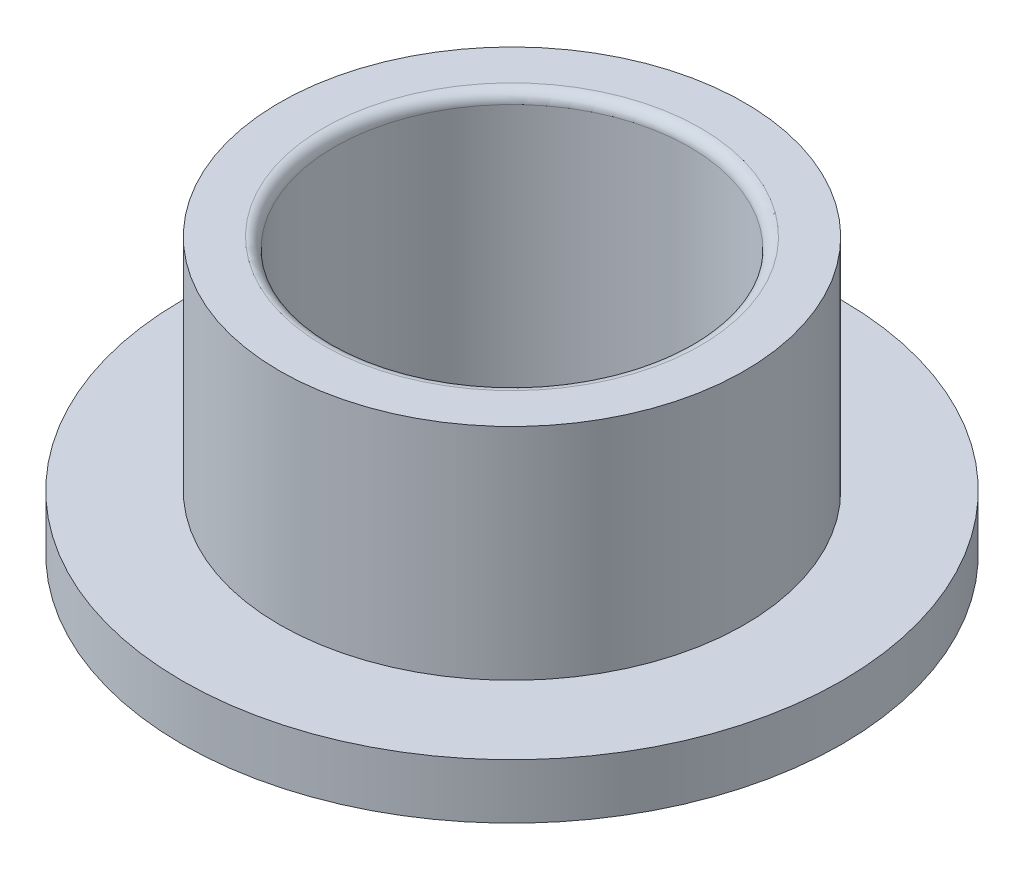
ISO-10303-21;
HEADER;
FILE_DESCRIPTION(('STEP AP214'),'2;1');
FILE_NAME('part.step','',(''),(''),'','','');
FILE_SCHEMA(('AUTOMOTIVE_DESIGN { 1 0 10303 214 1 1 1 1 }'));
ENDSEC;
DATA;
#1=APPLICATION_CONTEXT('core data for automotive mechanical design processes');
#2=APPLICATION_PROTOCOL_DEFINITION('international standard','automotive_design',2000,#1);
#3=PRODUCT_CONTEXT('',#1,'mechanical');
#4=PRODUCT('Part','Part','',(#3));
#5=PRODUCT_RELATED_PRODUCT_CATEGORY('part','',(#4));
#6=PRODUCT_DEFINITION_FORMATION('','',#4);
#7=PRODUCT_DEFINITION_CONTEXT('part definition',#1,'design');
#8=PRODUCT_DEFINITION('design','',#6,#7);
#9=PRODUCT_DEFINITION_SHAPE('','',#8);
#10=(LENGTH_UNIT() NAMED_UNIT(*) SI_UNIT(.MILLI.,.METRE.));
#11=(NAMED_UNIT(*) PLANE_ANGLE_UNIT() SI_UNIT($,.RADIAN.));
#12=(NAMED_UNIT(*) SI_UNIT($,.STERADIAN.) SOLID_ANGLE_UNIT());
#13=UNCERTAINTY_MEASURE_WITH_UNIT(LENGTH_MEASURE(1.E-05),#10,'distance_accuracy_value','');
#14=(GEOMETRIC_REPRESENTATION_CONTEXT(3) GLOBAL_UNCERTAINTY_ASSIGNED_CONTEXT((#13)) GLOBAL_UNIT_ASSIGNED_CONTEXT((#10,
#11,#12)) REPRESENTATION_CONTEXT('',''));
#15=CARTESIAN_POINT('',(0.,0.,0.));
#16=DIRECTION('',(0.,0.,1.));
#17=DIRECTION('',(1.,0.,0.));
#18=AXIS2_PLACEMENT_3D('',#15,#16,#17);
#19=CARTESIAN_POINT('',(0.,20.,0.));
#20=DIRECTION('',(0.,1.,0.));
#21=DIRECTION('',(0.,0.,1.));
#22=AXIS2_PLACEMENT_3D('',#19,#20,#21);
#23=PLANE('',#22);
#24=CARTESIAN_POINT('',(0.,20.,0.));
#25=DIRECTION('',(0.,1.,0.));
#26=DIRECTION('',(0.,0.,1.));
#27=AXIS2_PLACEMENT_3D('',#24,#25,#26);
#28=CIRCLE('',#27,17.15);
#29=CARTESIAN_POINT('',(0.,20.,17.15));
#30=VERTEX_POINT('',#29);
#31=EDGE_CURVE('E42',#30,#30,#28,.F.);
#32=ORIENTED_EDGE('',*,*,#31,.T.);
#33=EDGE_LOOP('',(#32));
#34=FACE_BOUND('',#33,.T.);
#35=CARTESIAN_POINT('',(0.,20.,0.));
#36=DIRECTION('',(0.,1.,0.));
#37=DIRECTION('',(0.,0.,1.));
#38=AXIS2_PLACEMENT_3D('',#35,#36,#37);
#39=CIRCLE('',#38,21.15);
#40=CARTESIAN_POINT('',(0.,20.,21.15));
#41=VERTEX_POINT('',#40);
#42=EDGE_CURVE('E51',#41,#41,#39,.T.);
#43=ORIENTED_EDGE('',*,*,#42,.T.);
#44=EDGE_LOOP('',(#43));
#45=FACE_BOUND('',#44,.T.);
#46=ADVANCED_FACE('F31',(#34,#45),#23,.T.);
#47=CARTESIAN_POINT('',(0.,20.,0.));
#48=DIRECTION('',(0.,-1.,0.));
#49=DIRECTION('',(0.,0.,-1.));
#50=AXIS2_PLACEMENT_3D('',#47,#48,#49);
#51=CYLINDRICAL_SURFACE('',#50,21.15);
#52=ORIENTED_EDGE('',*,*,#42,.F.);
#53=EDGE_LOOP('',(#52));
#54=FACE_BOUND('',#53,.T.);
#55=CARTESIAN_POINT('',(0.,0.,0.));
#56=DIRECTION('',(0.,1.,0.));
#57=DIRECTION('',(0.,0.,1.));
#58=AXIS2_PLACEMENT_3D('',#55,#56,#57);
#59=CIRCLE('',#58,21.15);
#60=CARTESIAN_POINT('',(0.,0.,21.15));
#61=VERTEX_POINT('',#60);
#62=EDGE_CURVE('E52',#61,#61,#59,.T.);
#63=ORIENTED_EDGE('',*,*,#62,.T.);
#64=EDGE_LOOP('',(#63));
#65=FACE_BOUND('',#64,.T.);
#66=ADVANCED_FACE('F83',(#54,#65),#51,.T.);
#67=CARTESIAN_POINT('',(0.,20.,0.));
#68=DIRECTION('',(0.,-1.,0.));
#69=DIRECTION('',(0.,0.,-1.));
#70=AXIS2_PLACEMENT_3D('',#67,#68,#69);
#71=CYLINDRICAL_SURFACE('',#70,16.15);
#72=CARTESIAN_POINT('',(0.,-4.,0.));
#73=DIRECTION('',(0.,-1.,0.));
#74=DIRECTION('',(0.,0.,-1.));
#75=AXIS2_PLACEMENT_3D('',#72,#73,#74);
#76=CIRCLE('',#75,16.15);
#77=CARTESIAN_POINT('',(0.,-4.,-16.15));
#78=VERTEX_POINT('',#77);
#79=EDGE_CURVE('E38',#78,#78,#76,.T.);
#80=ORIENTED_EDGE('',*,*,#79,.T.);
#81=EDGE_LOOP('',(#80));
#82=FACE_BOUND('',#81,.T.);
#83=CARTESIAN_POINT('',(0.,19.,0.));
#84=DIRECTION('',(0.,1.,0.));
#85=DIRECTION('',(0.,0.,1.));
#86=AXIS2_PLACEMENT_3D('',#83,#84,#85);
#87=CIRCLE('',#86,16.15);
#88=CARTESIAN_POINT('',(0.,19.,16.15));
#89=VERTEX_POINT('',#88);
#90=EDGE_CURVE('E46',#89,#89,#87,.T.);
#91=ORIENTED_EDGE('',*,*,#90,.T.);
#92=EDGE_LOOP('',(#91));
#93=FACE_BOUND('',#92,.T.);
#94=ADVANCED_FACE('F89',(#82,#93),#71,.F.);
#95=CARTESIAN_POINT('',(0.,19.,0.));
#96=DIRECTION('',(0.,1.,0.));
#97=DIRECTION('',(0.,0.,1.));
#98=AXIS2_PLACEMENT_3D('',#95,#96,#97);
#99=TOROIDAL_SURFACE('',#98,17.15,1.);
#100=ORIENTED_EDGE('',*,*,#31,.F.);
#101=EDGE_LOOP('',(#100));
#102=FACE_BOUND('',#101,.T.);
#103=ORIENTED_EDGE('',*,*,#90,.F.);
#104=EDGE_LOOP('',(#103));
#105=FACE_BOUND('',#104,.T.);
#106=ADVANCED_FACE('F79',(#102,#105),#99,.T.);
#107=CARTESIAN_POINT('',(0.,-5.,0.));
#108=DIRECTION('',(0.,-1.,0.));
#109=DIRECTION('',(0.,0.,-1.));
#110=AXIS2_PLACEMENT_3D('',#107,#108,#109);
#111=PLANE('',#110);
#112=CARTESIAN_POINT('',(0.,-5.,0.));
#113=DIRECTION('',(0.,-1.,0.));
#114=DIRECTION('',(0.,0.,-1.));
#115=AXIS2_PLACEMENT_3D('',#112,#113,#114);
#116=CIRCLE('',#115,17.15);
#117=CARTESIAN_POINT('',(0.,-5.,-17.15));
#118=VERTEX_POINT('',#117);
#119=EDGE_CURVE('E10',#118,#118,#116,.F.);
#120=ORIENTED_EDGE('',*,*,#119,.T.);
#121=EDGE_LOOP('',(#120));
#122=FACE_BOUND('',#121,.T.);
#123=CARTESIAN_POINT('',(0.,-5.,0.));
#124=DIRECTION('',(0.,-1.,0.));
#125=DIRECTION('',(0.,0.,-1.));
#126=AXIS2_PLACEMENT_3D('',#123,#124,#125);
#127=CIRCLE('',#126,30.);
#128=CARTESIAN_POINT('',(0.,-5.,-30.));
#129=VERTEX_POINT('',#128);
#130=EDGE_CURVE('E55',#129,#129,#127,.T.);
#131=ORIENTED_EDGE('',*,*,#130,.T.);
#132=EDGE_LOOP('',(#131));
#133=FACE_BOUND('',#132,.T.);
#134=ADVANCED_FACE('F64',(#122,#133),#111,.T.);
#135=CARTESIAN_POINT('',(0.,0.,0.));
#136=DIRECTION('',(0.,-1.,0.));
#137=DIRECTION('',(0.,0.,-1.));
#138=AXIS2_PLACEMENT_3D('',#135,#136,#137);
#139=PLANE('',#138);
#140=ORIENTED_EDGE('',*,*,#62,.F.);
#141=EDGE_LOOP('',(#140));
#142=FACE_BOUND('',#141,.T.);
#143=CARTESIAN_POINT('',(0.,0.,0.));
#144=DIRECTION('',(0.,-1.,0.));
#145=DIRECTION('',(0.,0.,-1.));
#146=AXIS2_PLACEMENT_3D('',#143,#144,#145);
#147=CIRCLE('',#146,30.);
#148=CARTESIAN_POINT('',(0.,0.,-30.));
#149=VERTEX_POINT('',#148);
#150=EDGE_CURVE('E58',#149,#149,#147,.T.);
#151=ORIENTED_EDGE('',*,*,#150,.F.);
#152=EDGE_LOOP('',(#151));
#153=FACE_BOUND('',#152,.T.);
#154=ADVANCED_FACE('F69',(#142,#153),#139,.F.);
#155=CARTESIAN_POINT('',(0.,-5.,0.));
#156=DIRECTION('',(0.,1.,0.));
#157=DIRECTION('',(0.,0.,1.));
#158=AXIS2_PLACEMENT_3D('',#155,#156,#157);
#159=CYLINDRICAL_SURFACE('',#158,30.);
#160=ORIENTED_EDGE('',*,*,#130,.F.);
#161=EDGE_LOOP('',(#160));
#162=FACE_BOUND('',#161,.T.);
#163=ORIENTED_EDGE('',*,*,#150,.T.);
#164=EDGE_LOOP('',(#163));
#165=FACE_BOUND('',#164,.T.);
#166=ADVANCED_FACE('F66',(#162,#165),#159,.T.);
#167=CARTESIAN_POINT('',(0.,-4.,0.));
#168=DIRECTION('',(0.,-1.,0.));
#169=DIRECTION('',(0.,0.,-1.));
#170=AXIS2_PLACEMENT_3D('',#167,#168,#169);
#171=TOROIDAL_SURFACE('',#170,17.15,1.);
#172=ORIENTED_EDGE('',*,*,#119,.F.);
#173=EDGE_LOOP('',(#172));
#174=FACE_BOUND('',#173,.T.);
#175=ORIENTED_EDGE('',*,*,#79,.F.);
#176=EDGE_LOOP('',(#175));
#177=FACE_BOUND('',#176,.T.);
#178=ADVANCED_FACE('F33',(#174,#177),#171,.T.);
#179=CLOSED_SHELL('',(#46,#66,#94,#106,#134,#154,#166,#178));
#180=MANIFOLD_SOLID_BREP('B2',#179);
#181=ADVANCED_BREP_SHAPE_REPRESENTATION('',(#18,#180),#14);
#182=SHAPE_DEFINITION_REPRESENTATION(#9,#181);
ENDSEC;
END-ISO-10303-21;
